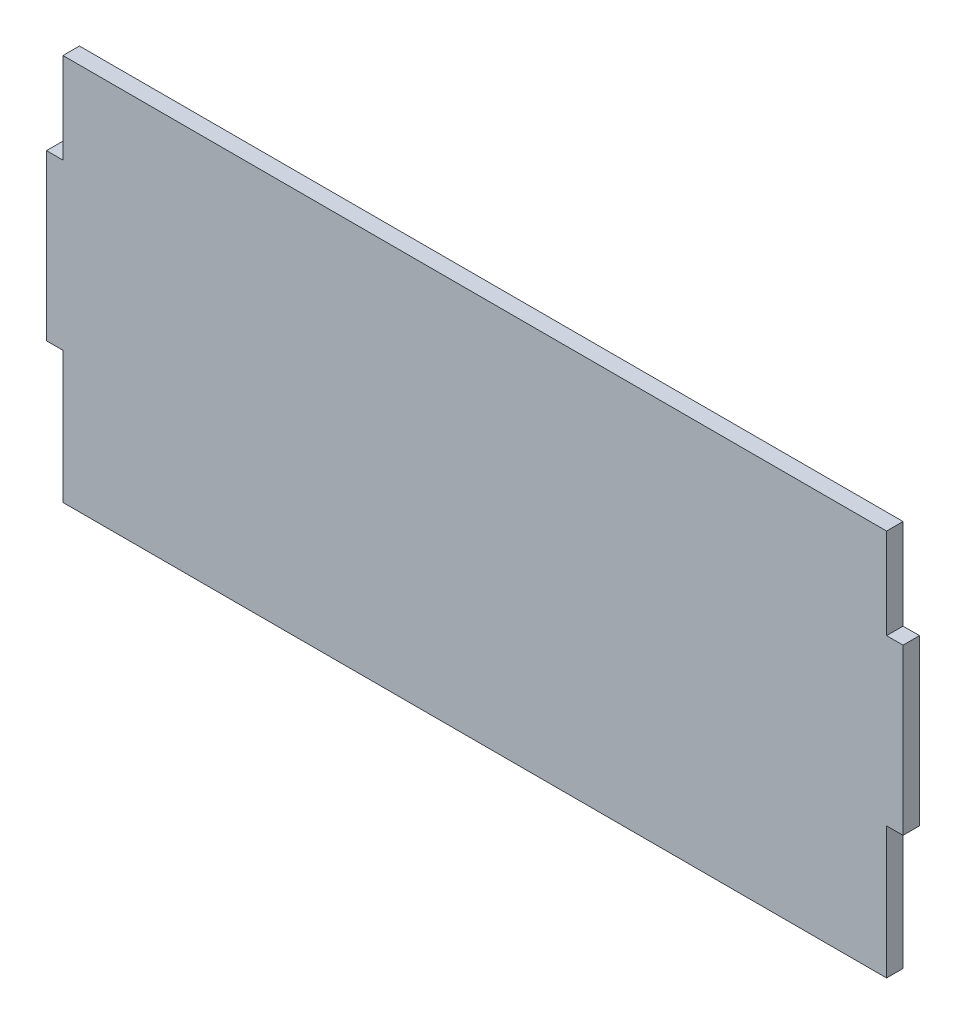
ISO-10303-21;
HEADER;
FILE_DESCRIPTION(('STEP AP214'),'2;1');
FILE_NAME('part.step','',(''),(''),'','','');
FILE_SCHEMA(('AUTOMOTIVE_DESIGN { 1 0 10303 214 1 1 1 1 }'));
ENDSEC;
DATA;
#1=APPLICATION_CONTEXT('core data for automotive mechanical design processes');
#2=APPLICATION_PROTOCOL_DEFINITION('international standard','automotive_design',2000,#1);
#3=PRODUCT_CONTEXT('',#1,'mechanical');
#4=PRODUCT('Part','Part','',(#3));
#5=PRODUCT_RELATED_PRODUCT_CATEGORY('part','',(#4));
#6=PRODUCT_DEFINITION_FORMATION('','',#4);
#7=PRODUCT_DEFINITION_CONTEXT('part definition',#1,'design');
#8=PRODUCT_DEFINITION('design','',#6,#7);
#9=PRODUCT_DEFINITION_SHAPE('','',#8);
#10=(LENGTH_UNIT() NAMED_UNIT(*) SI_UNIT(.MILLI.,.METRE.));
#11=(NAMED_UNIT(*) PLANE_ANGLE_UNIT() SI_UNIT($,.RADIAN.));
#12=(NAMED_UNIT(*) SI_UNIT($,.STERADIAN.) SOLID_ANGLE_UNIT());
#13=UNCERTAINTY_MEASURE_WITH_UNIT(LENGTH_MEASURE(1.E-05),#10,'distance_accuracy_value','');
#14=(GEOMETRIC_REPRESENTATION_CONTEXT(3) GLOBAL_UNCERTAINTY_ASSIGNED_CONTEXT((#13)) GLOBAL_UNIT_ASSIGNED_CONTEXT((#10,
#11,#12)) REPRESENTATION_CONTEXT('',''));
#15=CARTESIAN_POINT('',(0.,0.,0.));
#16=DIRECTION('',(0.,0.,1.));
#17=DIRECTION('',(1.,0.,0.));
#18=AXIS2_PLACEMENT_3D('',#15,#16,#17);
#19=CARTESIAN_POINT('',(3.33066907387588E-13,16.0000000000021,2.));
#20=DIRECTION('',(0.,1.,0.));
#21=DIRECTION('',(-1.,0.,0.));
#22=AXIS2_PLACEMENT_3D('',#19,#20,#21);
#23=PLANE('',#22);
#24=DIRECTION('',(1.,0.,0.));
#25=VECTOR('',#24,1.);
#26=CARTESIAN_POINT('',(3.33066907387588E-13,16.0000000000021,0.));
#27=LINE('',#26,#25);
#28=CARTESIAN_POINT('',(100.,16.,0.));
#29=VERTEX_POINT('',#28);
#30=CARTESIAN_POINT('',(102.,16.,0.));
#31=VERTEX_POINT('',#30);
#32=EDGE_CURVE('E177',#29,#31,#27,.T.);
#33=ORIENTED_EDGE('',*,*,#32,.T.);
#34=DIRECTION('',(0.,0.,-1.));
#35=VECTOR('',#34,1.);
#36=CARTESIAN_POINT('',(102.,16.,2.));
#37=LINE('',#36,#35);
#38=CARTESIAN_POINT('',(102.,16.,2.));
#39=VERTEX_POINT('',#38);
#40=EDGE_CURVE('E181',#39,#31,#37,.T.);
#41=ORIENTED_EDGE('',*,*,#40,.F.);
#42=DIRECTION('',(1.,0.,0.));
#43=VECTOR('',#42,1.);
#44=CARTESIAN_POINT('',(3.33066907387588E-13,16.0000000000021,2.));
#45=LINE('',#44,#43);
#46=CARTESIAN_POINT('',(100.,16.,2.));
#47=VERTEX_POINT('',#46);
#48=EDGE_CURVE('E185',#47,#39,#45,.T.);
#49=ORIENTED_EDGE('',*,*,#48,.F.);
#50=DIRECTION('',(0.,0.,-1.));
#51=VECTOR('',#50,1.);
#52=CARTESIAN_POINT('',(100.,16.,2.));
#53=LINE('',#52,#51);
#54=EDGE_CURVE('E184',#47,#29,#53,.T.);
#55=ORIENTED_EDGE('',*,*,#54,.T.);
#56=EDGE_LOOP('',(#33,#41,#49,#55));
#57=FACE_BOUND('',#56,.T.);
#58=ADVANCED_FACE('F71',(#57),#23,.F.);
#59=CARTESIAN_POINT('',(100.,0.,2.));
#60=DIRECTION('',(-1.,0.,0.));
#61=DIRECTION('',(0.,0.,1.));
#62=AXIS2_PLACEMENT_3D('',#59,#60,#61);
#63=PLANE('',#62);
#64=DIRECTION('',(0.,1.,0.));
#65=VECTOR('',#64,1.);
#66=CARTESIAN_POINT('',(100.,0.,0.));
#67=LINE('',#66,#65);
#68=CARTESIAN_POINT('',(100.,0.,0.));
#69=VERTEX_POINT('',#68);
#70=EDGE_CURVE('E176',#69,#29,#67,.T.);
#71=ORIENTED_EDGE('',*,*,#70,.T.);
#72=ORIENTED_EDGE('',*,*,#54,.F.);
#73=DIRECTION('',(0.,1.,0.));
#74=VECTOR('',#73,1.);
#75=CARTESIAN_POINT('',(100.,0.,2.));
#76=LINE('',#75,#74);
#77=CARTESIAN_POINT('',(100.,0.,2.));
#78=VERTEX_POINT('',#77);
#79=EDGE_CURVE('E238',#78,#47,#76,.T.);
#80=ORIENTED_EDGE('',*,*,#79,.F.);
#81=DIRECTION('',(0.,0.,-1.));
#82=VECTOR('',#81,1.);
#83=CARTESIAN_POINT('',(100.,0.,2.));
#84=LINE('',#83,#82);
#85=EDGE_CURVE('E188',#78,#69,#84,.T.);
#86=ORIENTED_EDGE('',*,*,#85,.T.);
#87=EDGE_LOOP('',(#71,#72,#80,#86));
#88=FACE_BOUND('',#87,.T.);
#89=ADVANCED_FACE('F220',(#88),#63,.F.);
#90=CARTESIAN_POINT('',(100.,36.,0.));
#91=VERTEX_POINT('',#90);
#92=CARTESIAN_POINT('',(100.,47.,0.));
#93=VERTEX_POINT('',#92);
#94=EDGE_CURVE('E170',#91,#93,#67,.T.);
#95=ORIENTED_EDGE('',*,*,#94,.T.);
#96=DIRECTION('',(0.,0.,-1.));
#97=VECTOR('',#96,1.);
#98=CARTESIAN_POINT('',(100.,47.,2.));
#99=LINE('',#98,#97);
#100=CARTESIAN_POINT('',(100.,47.,2.));
#101=VERTEX_POINT('',#100);
#102=EDGE_CURVE('E152',#101,#93,#99,.T.);
#103=ORIENTED_EDGE('',*,*,#102,.F.);
#104=CARTESIAN_POINT('',(100.,36.,2.));
#105=VERTEX_POINT('',#104);
#106=EDGE_CURVE('E246',#105,#101,#76,.T.);
#107=ORIENTED_EDGE('',*,*,#106,.F.);
#108=DIRECTION('',(0.,0.,-1.));
#109=VECTOR('',#108,1.);
#110=CARTESIAN_POINT('',(100.,36.,2.));
#111=LINE('',#110,#109);
#112=EDGE_CURVE('E144',#105,#91,#111,.T.);
#113=ORIENTED_EDGE('',*,*,#112,.T.);
#114=EDGE_LOOP('',(#95,#103,#107,#113));
#115=FACE_BOUND('',#114,.T.);
#116=ADVANCED_FACE('F209',(#115),#63,.F.);
#117=CARTESIAN_POINT('',(7.49400541622018E-13,36.0000000000021,2.));
#118=DIRECTION('',(0.,1.,0.));
#119=DIRECTION('',(-1.,0.,0.));
#120=AXIS2_PLACEMENT_3D('',#117,#118,#119);
#121=PLANE('',#120);
#122=DIRECTION('',(1.,0.,0.));
#123=VECTOR('',#122,1.);
#124=CARTESIAN_POINT('',(7.49400541622018E-13,36.0000000000021,0.));
#125=LINE('',#124,#123);
#126=CARTESIAN_POINT('',(102.,36.,0.));
#127=VERTEX_POINT('',#126);
#128=EDGE_CURVE('E212',#91,#127,#125,.T.);
#129=ORIENTED_EDGE('',*,*,#128,.F.);
#130=ORIENTED_EDGE('',*,*,#112,.F.);
#131=DIRECTION('',(1.,0.,0.));
#132=VECTOR('',#131,1.);
#133=CARTESIAN_POINT('',(7.49400541622018E-13,36.0000000000021,2.));
#134=LINE('',#133,#132);
#135=CARTESIAN_POINT('',(102.,36.,2.));
#136=VERTEX_POINT('',#135);
#137=EDGE_CURVE('E249',#105,#136,#134,.T.);
#138=ORIENTED_EDGE('',*,*,#137,.T.);
#139=DIRECTION('',(0.,0.,-1.));
#140=VECTOR('',#139,1.);
#141=CARTESIAN_POINT('',(102.,36.,2.));
#142=LINE('',#141,#140);
#143=EDGE_CURVE('E140',#136,#127,#142,.T.);
#144=ORIENTED_EDGE('',*,*,#143,.T.);
#145=EDGE_LOOP('',(#129,#130,#138,#144));
#146=FACE_BOUND('',#145,.T.);
#147=ADVANCED_FACE('F262',(#146),#121,.T.);
#148=CARTESIAN_POINT('',(102.,0.,2.));
#149=DIRECTION('',(1.,0.,0.));
#150=DIRECTION('',(0.,0.,-1.));
#151=AXIS2_PLACEMENT_3D('',#148,#149,#150);
#152=PLANE('',#151);
#153=DIRECTION('',(0.,-1.,0.));
#154=VECTOR('',#153,1.);
#155=CARTESIAN_POINT('',(102.,0.,0.));
#156=LINE('',#155,#154);
#157=EDGE_CURVE('E213',#127,#31,#156,.T.);
#158=ORIENTED_EDGE('',*,*,#157,.F.);
#159=ORIENTED_EDGE('',*,*,#143,.F.);
#160=DIRECTION('',(0.,-1.,0.));
#161=VECTOR('',#160,1.);
#162=CARTESIAN_POINT('',(102.,0.,2.));
#163=LINE('',#162,#161);
#164=EDGE_CURVE('E180',#136,#39,#163,.T.);
#165=ORIENTED_EDGE('',*,*,#164,.T.);
#166=ORIENTED_EDGE('',*,*,#40,.T.);
#167=EDGE_LOOP('',(#158,#159,#165,#166));
#168=FACE_BOUND('',#167,.T.);
#169=ADVANCED_FACE('F254',(#168),#152,.T.);
#170=CARTESIAN_POINT('',(0.,47.,2.));
#171=DIRECTION('',(0.,1.,0.));
#172=DIRECTION('',(0.,0.,1.));
#173=AXIS2_PLACEMENT_3D('',#170,#171,#172);
#174=PLANE('',#173);
#175=DIRECTION('',(1.,0.,0.));
#176=VECTOR('',#175,1.);
#177=CARTESIAN_POINT('',(0.,47.,0.));
#178=LINE('',#177,#176);
#179=CARTESIAN_POINT('',(0.,47.,0.));
#180=VERTEX_POINT('',#179);
#181=EDGE_CURVE('E167',#180,#93,#178,.T.);
#182=ORIENTED_EDGE('',*,*,#181,.F.);
#183=DIRECTION('',(0.,0.,-1.));
#184=VECTOR('',#183,1.);
#185=CARTESIAN_POINT('',(0.,47.,2.));
#186=LINE('',#185,#184);
#187=CARTESIAN_POINT('',(0.,47.,2.));
#188=VERTEX_POINT('',#187);
#189=EDGE_CURVE('E165',#188,#180,#186,.T.);
#190=ORIENTED_EDGE('',*,*,#189,.F.);
#191=DIRECTION('',(1.,0.,0.));
#192=VECTOR('',#191,1.);
#193=CARTESIAN_POINT('',(0.,47.,2.));
#194=LINE('',#193,#192);
#195=EDGE_CURVE('E203',#188,#101,#194,.T.);
#196=ORIENTED_EDGE('',*,*,#195,.T.);
#197=ORIENTED_EDGE('',*,*,#102,.T.);
#198=EDGE_LOOP('',(#182,#190,#196,#197));
#199=FACE_BOUND('',#198,.T.);
#200=ADVANCED_FACE('F200',(#199),#174,.T.);
#201=CARTESIAN_POINT('',(0.,0.,2.));
#202=DIRECTION('',(0.,1.,0.));
#203=DIRECTION('',(0.,0.,1.));
#204=AXIS2_PLACEMENT_3D('',#201,#202,#203);
#205=PLANE('',#204);
#206=DIRECTION('',(1.,0.,0.));
#207=VECTOR('',#206,1.);
#208=CARTESIAN_POINT('',(0.,0.,0.));
#209=LINE('',#208,#207);
#210=CARTESIAN_POINT('',(0.,0.,0.));
#211=VERTEX_POINT('',#210);
#212=EDGE_CURVE('E169',#211,#69,#209,.T.);
#213=ORIENTED_EDGE('',*,*,#212,.T.);
#214=ORIENTED_EDGE('',*,*,#85,.F.);
#215=DIRECTION('',(1.,0.,0.));
#216=VECTOR('',#215,1.);
#217=CARTESIAN_POINT('',(0.,0.,2.));
#218=LINE('',#217,#216);
#219=CARTESIAN_POINT('',(0.,0.,2.));
#220=VERTEX_POINT('',#219);
#221=EDGE_CURVE('E239',#220,#78,#218,.T.);
#222=ORIENTED_EDGE('',*,*,#221,.F.);
#223=DIRECTION('',(0.,0.,-1.));
#224=VECTOR('',#223,1.);
#225=CARTESIAN_POINT('',(0.,0.,2.));
#226=LINE('',#225,#224);
#227=EDGE_CURVE('E191',#220,#211,#226,.T.);
#228=ORIENTED_EDGE('',*,*,#227,.T.);
#229=EDGE_LOOP('',(#213,#214,#222,#228));
#230=FACE_BOUND('',#229,.T.);
#231=ADVANCED_FACE('F282',(#230),#205,.F.);
#232=CARTESIAN_POINT('',(0.,0.,0.));
#233=DIRECTION('',(0.,0.,1.));
#234=DIRECTION('',(1.,0.,0.));
#235=AXIS2_PLACEMENT_3D('',#232,#233,#234);
#236=PLANE('',#235);
#237=ORIENTED_EDGE('',*,*,#157,.T.);
#238=ORIENTED_EDGE('',*,*,#32,.F.);
#239=ORIENTED_EDGE('',*,*,#70,.F.);
#240=ORIENTED_EDGE('',*,*,#212,.F.);
#241=DIRECTION('',(0.,1.,0.));
#242=VECTOR('',#241,1.);
#243=CARTESIAN_POINT('',(0.,0.,0.));
#244=LINE('',#243,#242);
#245=CARTESIAN_POINT('',(0.,16.,0.));
#246=VERTEX_POINT('',#245);
#247=EDGE_CURVE('E131',#211,#246,#244,.T.);
#248=ORIENTED_EDGE('',*,*,#247,.T.);
#249=DIRECTION('',(-1.,0.,0.));
#250=VECTOR('',#249,1.);
#251=CARTESIAN_POINT('',(0.,16.,0.));
#252=LINE('',#251,#250);
#253=CARTESIAN_POINT('',(-2.,16.,0.));
#254=VERTEX_POINT('',#253);
#255=EDGE_CURVE('E117',#246,#254,#252,.T.);
#256=ORIENTED_EDGE('',*,*,#255,.T.);
#257=DIRECTION('',(0.,-1.,0.));
#258=VECTOR('',#257,1.);
#259=CARTESIAN_POINT('',(-2.,36.,0.));
#260=LINE('',#259,#258);
#261=CARTESIAN_POINT('',(-2.,36.,0.));
#262=VERTEX_POINT('',#261);
#263=EDGE_CURVE('E107',#262,#254,#260,.T.);
#264=ORIENTED_EDGE('',*,*,#263,.F.);
#265=DIRECTION('',(-1.,0.,0.));
#266=VECTOR('',#265,1.);
#267=CARTESIAN_POINT('',(0.,36.,0.));
#268=LINE('',#267,#266);
#269=CARTESIAN_POINT('',(0.,36.,0.));
#270=VERTEX_POINT('',#269);
#271=EDGE_CURVE('E125',#270,#262,#268,.T.);
#272=ORIENTED_EDGE('',*,*,#271,.F.);
#273=EDGE_CURVE('E161',#270,#180,#244,.T.);
#274=ORIENTED_EDGE('',*,*,#273,.T.);
#275=ORIENTED_EDGE('',*,*,#181,.T.);
#276=ORIENTED_EDGE('',*,*,#94,.F.);
#277=ORIENTED_EDGE('',*,*,#128,.T.);
#278=EDGE_LOOP('',(#237,#238,#239,#240,#248,#256,#264,#272,#274,#275,#276,#277));
#279=FACE_BOUND('',#278,.T.);
#280=ADVANCED_FACE('F128',(#279),#236,.F.);
#281=CARTESIAN_POINT('',(0.,0.,2.));
#282=DIRECTION('',(0.,0.,1.));
#283=DIRECTION('',(1.,0.,0.));
#284=AXIS2_PLACEMENT_3D('',#281,#282,#283);
#285=PLANE('',#284);
#286=ORIENTED_EDGE('',*,*,#164,.F.);
#287=ORIENTED_EDGE('',*,*,#137,.F.);
#288=ORIENTED_EDGE('',*,*,#106,.T.);
#289=ORIENTED_EDGE('',*,*,#195,.F.);
#290=DIRECTION('',(0.,1.,0.));
#291=VECTOR('',#290,1.);
#292=CARTESIAN_POINT('',(0.,0.,2.));
#293=LINE('',#292,#291);
#294=CARTESIAN_POINT('',(0.,36.,2.));
#295=VERTEX_POINT('',#294);
#296=EDGE_CURVE('E244',#295,#188,#293,.T.);
#297=ORIENTED_EDGE('',*,*,#296,.F.);
#298=DIRECTION('',(-1.,0.,0.));
#299=VECTOR('',#298,1.);
#300=CARTESIAN_POINT('',(0.,36.,2.));
#301=LINE('',#300,#299);
#302=CARTESIAN_POINT('',(-2.,36.,2.));
#303=VERTEX_POINT('',#302);
#304=EDGE_CURVE('E132',#295,#303,#301,.T.);
#305=ORIENTED_EDGE('',*,*,#304,.T.);
#306=DIRECTION('',(0.,-1.,0.));
#307=VECTOR('',#306,1.);
#308=CARTESIAN_POINT('',(-2.,36.,2.));
#309=LINE('',#308,#307);
#310=CARTESIAN_POINT('',(-2.,16.,2.));
#311=VERTEX_POINT('',#310);
#312=EDGE_CURVE('E135',#303,#311,#309,.T.);
#313=ORIENTED_EDGE('',*,*,#312,.T.);
#314=DIRECTION('',(-1.,0.,0.));
#315=VECTOR('',#314,1.);
#316=CARTESIAN_POINT('',(0.,16.,2.));
#317=LINE('',#316,#315);
#318=CARTESIAN_POINT('',(0.,16.,2.));
#319=VERTEX_POINT('',#318);
#320=EDGE_CURVE('E120',#319,#311,#317,.T.);
#321=ORIENTED_EDGE('',*,*,#320,.F.);
#322=EDGE_CURVE('E242',#220,#319,#293,.T.);
#323=ORIENTED_EDGE('',*,*,#322,.F.);
#324=ORIENTED_EDGE('',*,*,#221,.T.);
#325=ORIENTED_EDGE('',*,*,#79,.T.);
#326=ORIENTED_EDGE('',*,*,#48,.T.);
#327=EDGE_LOOP('',(#286,#287,#288,#289,#297,#305,#313,#321,#323,#324,#325,#326));
#328=FACE_BOUND('',#327,.T.);
#329=ADVANCED_FACE('F258',(#328),#285,.T.);
#330=CARTESIAN_POINT('',(0.,0.,2.));
#331=DIRECTION('',(-1.,0.,0.));
#332=DIRECTION('',(0.,-1.,0.));
#333=AXIS2_PLACEMENT_3D('',#330,#331,#332);
#334=PLANE('',#333);
#335=ORIENTED_EDGE('',*,*,#322,.T.);
#336=DIRECTION('',(0.,0.,-1.));
#337=VECTOR('',#336,1.);
#338=CARTESIAN_POINT('',(0.,16.,2.));
#339=LINE('',#338,#337);
#340=EDGE_CURVE('E81',#319,#246,#339,.T.);
#341=ORIENTED_EDGE('',*,*,#340,.T.);
#342=ORIENTED_EDGE('',*,*,#247,.F.);
#343=ORIENTED_EDGE('',*,*,#227,.F.);
#344=EDGE_LOOP('',(#335,#341,#342,#343));
#345=FACE_BOUND('',#344,.T.);
#346=ADVANCED_FACE('F284',(#345),#334,.T.);
#347=DIRECTION('',(0.,0.,-1.));
#348=VECTOR('',#347,1.);
#349=CARTESIAN_POINT('',(0.,36.,2.));
#350=LINE('',#349,#348);
#351=EDGE_CURVE('E12',#295,#270,#350,.T.);
#352=ORIENTED_EDGE('',*,*,#351,.F.);
#353=ORIENTED_EDGE('',*,*,#296,.T.);
#354=ORIENTED_EDGE('',*,*,#189,.T.);
#355=ORIENTED_EDGE('',*,*,#273,.F.);
#356=EDGE_LOOP('',(#352,#353,#354,#355));
#357=FACE_BOUND('',#356,.T.);
#358=ADVANCED_FACE('F163',(#357),#334,.T.);
#359=CARTESIAN_POINT('',(-2.,36.,2.));
#360=DIRECTION('',(1.,0.,0.));
#361=DIRECTION('',(0.,1.,0.));
#362=AXIS2_PLACEMENT_3D('',#359,#360,#361);
#363=PLANE('',#362);
#364=ORIENTED_EDGE('',*,*,#263,.T.);
#365=DIRECTION('',(0.,0.,-1.));
#366=VECTOR('',#365,1.);
#367=CARTESIAN_POINT('',(-2.,16.,2.));
#368=LINE('',#367,#366);
#369=EDGE_CURVE('E114',#311,#254,#368,.T.);
#370=ORIENTED_EDGE('',*,*,#369,.F.);
#371=ORIENTED_EDGE('',*,*,#312,.F.);
#372=DIRECTION('',(0.,0.,-1.));
#373=VECTOR('',#372,1.);
#374=CARTESIAN_POINT('',(-2.,36.,2.));
#375=LINE('',#374,#373);
#376=EDGE_CURVE('E75',#303,#262,#375,.T.);
#377=ORIENTED_EDGE('',*,*,#376,.T.);
#378=EDGE_LOOP('',(#364,#370,#371,#377));
#379=FACE_BOUND('',#378,.T.);
#380=ADVANCED_FACE('F122',(#379),#363,.F.);
#381=CARTESIAN_POINT('',(0.,16.,2.));
#382=DIRECTION('',(0.,-1.,0.));
#383=DIRECTION('',(1.,0.,0.));
#384=AXIS2_PLACEMENT_3D('',#381,#382,#383);
#385=PLANE('',#384);
#386=ORIENTED_EDGE('',*,*,#255,.F.);
#387=ORIENTED_EDGE('',*,*,#340,.F.);
#388=ORIENTED_EDGE('',*,*,#320,.T.);
#389=ORIENTED_EDGE('',*,*,#369,.T.);
#390=EDGE_LOOP('',(#386,#387,#388,#389));
#391=FACE_BOUND('',#390,.T.);
#392=ADVANCED_FACE('F115',(#391),#385,.T.);
#393=CARTESIAN_POINT('',(0.,36.,2.));
#394=DIRECTION('',(0.,-1.,0.));
#395=DIRECTION('',(1.,0.,0.));
#396=AXIS2_PLACEMENT_3D('',#393,#394,#395);
#397=PLANE('',#396);
#398=ORIENTED_EDGE('',*,*,#271,.T.);
#399=ORIENTED_EDGE('',*,*,#376,.F.);
#400=ORIENTED_EDGE('',*,*,#304,.F.);
#401=ORIENTED_EDGE('',*,*,#351,.T.);
#402=EDGE_LOOP('',(#398,#399,#400,#401));
#403=FACE_BOUND('',#402,.T.);
#404=ADVANCED_FACE('F73',(#403),#397,.F.);
#405=CLOSED_SHELL('',(#58,#89,#116,#147,#169,#200,#231,#280,#329,#346,#358,#380,#392,#404));
#406=MANIFOLD_SOLID_BREP('B2',#405);
#407=ADVANCED_BREP_SHAPE_REPRESENTATION('',(#18,#406),#14);
#408=SHAPE_DEFINITION_REPRESENTATION(#9,#407);
ENDSEC;
END-ISO-10303-21;
